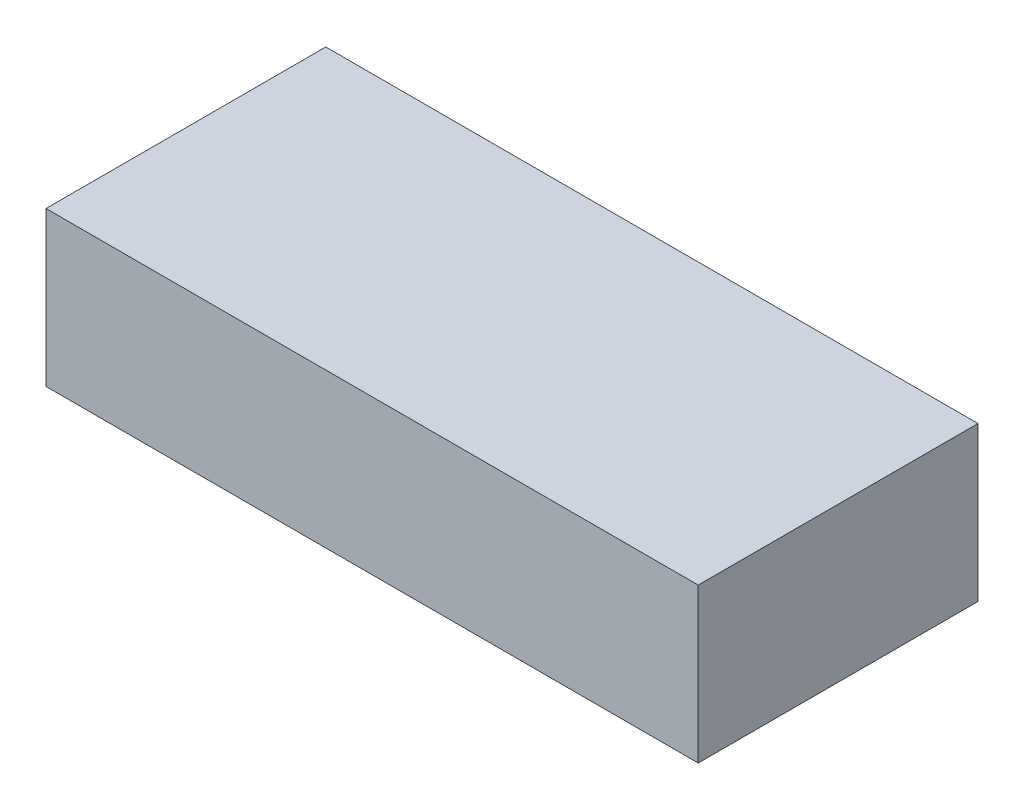
ISO-10303-21;
HEADER;
FILE_DESCRIPTION(('STEP AP214'),'2;1');
FILE_NAME('part.step','',(''),(''),'','','');
FILE_SCHEMA(('AUTOMOTIVE_DESIGN { 1 0 10303 214 1 1 1 1 }'));
ENDSEC;
DATA;
#1=APPLICATION_CONTEXT('core data for automotive mechanical design processes');
#2=APPLICATION_PROTOCOL_DEFINITION('international standard','automotive_design',2000,#1);
#3=PRODUCT_CONTEXT('',#1,'mechanical');
#4=PRODUCT('Part','Part','',(#3));
#5=PRODUCT_RELATED_PRODUCT_CATEGORY('part','',(#4));
#6=PRODUCT_DEFINITION_FORMATION('','',#4);
#7=PRODUCT_DEFINITION_CONTEXT('part definition',#1,'design');
#8=PRODUCT_DEFINITION('design','',#6,#7);
#9=PRODUCT_DEFINITION_SHAPE('','',#8);
#10=(LENGTH_UNIT() NAMED_UNIT(*) SI_UNIT(.MILLI.,.METRE.));
#11=(NAMED_UNIT(*) PLANE_ANGLE_UNIT() SI_UNIT($,.RADIAN.));
#12=(NAMED_UNIT(*) SI_UNIT($,.STERADIAN.) SOLID_ANGLE_UNIT());
#13=UNCERTAINTY_MEASURE_WITH_UNIT(LENGTH_MEASURE(1.E-05),#10,'distance_accuracy_value','');
#14=(GEOMETRIC_REPRESENTATION_CONTEXT(3) GLOBAL_UNCERTAINTY_ASSIGNED_CONTEXT((#13)) GLOBAL_UNIT_ASSIGNED_CONTEXT((#10,
#11,#12)) REPRESENTATION_CONTEXT('',''));
#15=CARTESIAN_POINT('',(0.,0.,0.));
#16=DIRECTION('',(0.,0.,1.));
#17=DIRECTION('',(1.,0.,0.));
#18=AXIS2_PLACEMENT_3D('',#15,#16,#17);
#19=CARTESIAN_POINT('',(74.69,17.65,0.));
#20=DIRECTION('',(-1.,0.,0.));
#21=DIRECTION('',(0.,0.,1.));
#22=AXIS2_PLACEMENT_3D('',#19,#20,#21);
#23=PLANE('',#22);
#24=DIRECTION('',(0.,0.,-1.));
#25=VECTOR('',#24,1.);
#26=CARTESIAN_POINT('',(74.69,0.,0.));
#27=LINE('',#26,#25);
#28=CARTESIAN_POINT('',(74.69,0.,0.));
#29=VERTEX_POINT('',#28);
#30=CARTESIAN_POINT('',(74.69,0.,-32.04));
#31=VERTEX_POINT('',#30);
#32=EDGE_CURVE('E100',#29,#31,#27,.T.);
#33=ORIENTED_EDGE('',*,*,#32,.T.);
#34=DIRECTION('',(0.,-1.,0.));
#35=VECTOR('',#34,1.);
#36=CARTESIAN_POINT('',(74.69,17.65,-32.04));
#37=LINE('',#36,#35);
#38=CARTESIAN_POINT('',(74.69,17.65,-32.04));
#39=VERTEX_POINT('',#38);
#40=EDGE_CURVE('E11',#39,#31,#37,.T.);
#41=ORIENTED_EDGE('',*,*,#40,.F.);
#42=DIRECTION('',(0.,0.,-1.));
#43=VECTOR('',#42,1.);
#44=CARTESIAN_POINT('',(74.69,17.65,0.));
#45=LINE('',#44,#43);
#46=CARTESIAN_POINT('',(74.69,17.65,0.));
#47=VERTEX_POINT('',#46);
#48=EDGE_CURVE('E88',#47,#39,#45,.T.);
#49=ORIENTED_EDGE('',*,*,#48,.F.);
#50=DIRECTION('',(0.,-1.,0.));
#51=VECTOR('',#50,1.);
#52=CARTESIAN_POINT('',(74.69,17.65,0.));
#53=LINE('',#52,#51);
#54=EDGE_CURVE('E96',#47,#29,#53,.T.);
#55=ORIENTED_EDGE('',*,*,#54,.T.);
#56=EDGE_LOOP('',(#33,#41,#49,#55));
#57=FACE_BOUND('',#56,.T.);
#58=ADVANCED_FACE('F37',(#57),#23,.F.);
#59=CARTESIAN_POINT('',(74.69,17.65,-32.04));
#60=DIRECTION('',(0.,0.,1.));
#61=DIRECTION('',(1.,0.,0.));
#62=AXIS2_PLACEMENT_3D('',#59,#60,#61);
#63=PLANE('',#62);
#64=DIRECTION('',(-1.,0.,0.));
#65=VECTOR('',#64,1.);
#66=CARTESIAN_POINT('',(74.69,0.,-32.04));
#67=LINE('',#66,#65);
#68=CARTESIAN_POINT('',(0.,0.,-32.04));
#69=VERTEX_POINT('',#68);
#70=EDGE_CURVE('E92',#31,#69,#67,.T.);
#71=ORIENTED_EDGE('',*,*,#70,.T.);
#72=DIRECTION('',(0.,-1.,0.));
#73=VECTOR('',#72,1.);
#74=CARTESIAN_POINT('',(0.,17.65,-32.04));
#75=LINE('',#74,#73);
#76=CARTESIAN_POINT('',(0.,17.65,-32.04));
#77=VERTEX_POINT('',#76);
#78=EDGE_CURVE('E45',#77,#69,#75,.T.);
#79=ORIENTED_EDGE('',*,*,#78,.F.);
#80=DIRECTION('',(-1.,0.,0.));
#81=VECTOR('',#80,1.);
#82=CARTESIAN_POINT('',(74.69,17.65,-32.04));
#83=LINE('',#82,#81);
#84=EDGE_CURVE('E83',#39,#77,#83,.T.);
#85=ORIENTED_EDGE('',*,*,#84,.F.);
#86=ORIENTED_EDGE('',*,*,#40,.T.);
#87=EDGE_LOOP('',(#71,#79,#85,#86));
#88=FACE_BOUND('',#87,.T.);
#89=ADVANCED_FACE('F91',(#88),#63,.F.);
#90=CARTESIAN_POINT('',(0.,17.65,-32.04));
#91=DIRECTION('',(1.,0.,0.));
#92=DIRECTION('',(0.,0.,-1.));
#93=AXIS2_PLACEMENT_3D('',#90,#91,#92);
#94=PLANE('',#93);
#95=DIRECTION('',(0.,0.,1.));
#96=VECTOR('',#95,1.);
#97=CARTESIAN_POINT('',(0.,0.,-32.04));
#98=LINE('',#97,#96);
#99=CARTESIAN_POINT('',(0.,0.,0.));
#100=VERTEX_POINT('',#99);
#101=EDGE_CURVE('E70',#69,#100,#98,.T.);
#102=ORIENTED_EDGE('',*,*,#101,.T.);
#103=DIRECTION('',(0.,-1.,0.));
#104=VECTOR('',#103,1.);
#105=CARTESIAN_POINT('',(0.,17.65,0.));
#106=LINE('',#105,#104);
#107=CARTESIAN_POINT('',(0.,17.65,0.));
#108=VERTEX_POINT('',#107);
#109=EDGE_CURVE('E93',#108,#100,#106,.T.);
#110=ORIENTED_EDGE('',*,*,#109,.F.);
#111=DIRECTION('',(0.,0.,1.));
#112=VECTOR('',#111,1.);
#113=CARTESIAN_POINT('',(0.,17.65,-32.04));
#114=LINE('',#113,#112);
#115=EDGE_CURVE('E86',#77,#108,#114,.T.);
#116=ORIENTED_EDGE('',*,*,#115,.F.);
#117=ORIENTED_EDGE('',*,*,#78,.T.);
#118=EDGE_LOOP('',(#102,#110,#116,#117));
#119=FACE_BOUND('',#118,.T.);
#120=ADVANCED_FACE('F94',(#119),#94,.F.);
#121=CARTESIAN_POINT('',(0.,17.65,0.));
#122=DIRECTION('',(0.,0.,-1.));
#123=DIRECTION('',(-1.,0.,0.));
#124=AXIS2_PLACEMENT_3D('',#121,#122,#123);
#125=PLANE('',#124);
#126=DIRECTION('',(1.,0.,0.));
#127=VECTOR('',#126,1.);
#128=CARTESIAN_POINT('',(0.,0.,0.));
#129=LINE('',#128,#127);
#130=EDGE_CURVE('E76',#100,#29,#129,.T.);
#131=ORIENTED_EDGE('',*,*,#130,.T.);
#132=ORIENTED_EDGE('',*,*,#54,.F.);
#133=DIRECTION('',(1.,0.,0.));
#134=VECTOR('',#133,1.);
#135=CARTESIAN_POINT('',(0.,17.65,0.));
#136=LINE('',#135,#134);
#137=EDGE_CURVE('E53',#108,#47,#136,.T.);
#138=ORIENTED_EDGE('',*,*,#137,.F.);
#139=ORIENTED_EDGE('',*,*,#109,.T.);
#140=EDGE_LOOP('',(#131,#132,#138,#139));
#141=FACE_BOUND('',#140,.T.);
#142=ADVANCED_FACE('F107',(#141),#125,.F.);
#143=CARTESIAN_POINT('',(0.,17.65,0.));
#144=DIRECTION('',(0.,1.,0.));
#145=DIRECTION('',(0.,0.,1.));
#146=AXIS2_PLACEMENT_3D('',#143,#144,#145);
#147=PLANE('',#146);
#148=ORIENTED_EDGE('',*,*,#48,.T.);
#149=ORIENTED_EDGE('',*,*,#84,.T.);
#150=ORIENTED_EDGE('',*,*,#115,.T.);
#151=ORIENTED_EDGE('',*,*,#137,.T.);
#152=EDGE_LOOP('',(#148,#149,#150,#151));
#153=FACE_BOUND('',#152,.T.);
#154=ADVANCED_FACE('F84',(#153),#147,.T.);
#155=CARTESIAN_POINT('',(0.,0.,0.));
#156=DIRECTION('',(0.,1.,0.));
#157=DIRECTION('',(0.,0.,1.));
#158=AXIS2_PLACEMENT_3D('',#155,#156,#157);
#159=PLANE('',#158);
#160=ORIENTED_EDGE('',*,*,#32,.F.);
#161=ORIENTED_EDGE('',*,*,#130,.F.);
#162=ORIENTED_EDGE('',*,*,#101,.F.);
#163=ORIENTED_EDGE('',*,*,#70,.F.);
#164=EDGE_LOOP('',(#160,#161,#162,#163));
#165=FACE_BOUND('',#164,.T.);
#166=ADVANCED_FACE('F110',(#165),#159,.F.);
#167=CLOSED_SHELL('',(#58,#89,#120,#142,#154,#166));
#168=MANIFOLD_SOLID_BREP('B2',#167);
#169=ADVANCED_BREP_SHAPE_REPRESENTATION('',(#18,#168),#14);
#170=SHAPE_DEFINITION_REPRESENTATION(#9,#169);
ENDSEC;
END-ISO-10303-21;
